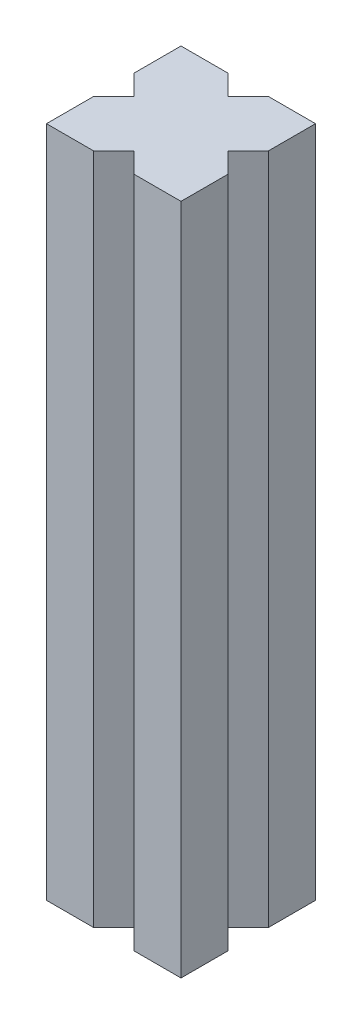
ISO-10303-21;
HEADER;
FILE_DESCRIPTION(('STEP AP214'),'2;1');
FILE_NAME('part.step','',(''),(''),'','','');
FILE_SCHEMA(('AUTOMOTIVE_DESIGN { 1 0 10303 214 1 1 1 1 }'));
ENDSEC;
DATA;
#1=APPLICATION_CONTEXT('core data for automotive mechanical design processes');
#2=APPLICATION_PROTOCOL_DEFINITION('international standard','automotive_design',2000,#1);
#3=PRODUCT_CONTEXT('',#1,'mechanical');
#4=PRODUCT('Part','Part','',(#3));
#5=PRODUCT_RELATED_PRODUCT_CATEGORY('part','',(#4));
#6=PRODUCT_DEFINITION_FORMATION('','',#4);
#7=PRODUCT_DEFINITION_CONTEXT('part definition',#1,'design');
#8=PRODUCT_DEFINITION('design','',#6,#7);
#9=PRODUCT_DEFINITION_SHAPE('','',#8);
#10=(LENGTH_UNIT() NAMED_UNIT(*) SI_UNIT(.MILLI.,.METRE.));
#11=(NAMED_UNIT(*) PLANE_ANGLE_UNIT() SI_UNIT($,.RADIAN.));
#12=(NAMED_UNIT(*) SI_UNIT($,.STERADIAN.) SOLID_ANGLE_UNIT());
#13=UNCERTAINTY_MEASURE_WITH_UNIT(LENGTH_MEASURE(1.E-05),#10,'distance_accuracy_value','');
#14=(GEOMETRIC_REPRESENTATION_CONTEXT(3) GLOBAL_UNCERTAINTY_ASSIGNED_CONTEXT((#13)) GLOBAL_UNIT_ASSIGNED_CONTEXT((#10,
#11,#12)) REPRESENTATION_CONTEXT('',''));
#15=CARTESIAN_POINT('',(0.,0.,0.));
#16=DIRECTION('',(0.,0.,1.));
#17=DIRECTION('',(1.,0.,0.));
#18=AXIS2_PLACEMENT_3D('',#15,#16,#17);
#19=CARTESIAN_POINT('',(0.,100.,0.));
#20=DIRECTION('',(1.,0.,0.));
#21=DIRECTION('',(0.,0.,-1.));
#22=AXIS2_PLACEMENT_3D('',#19,#20,#21);
#23=PLANE('',#22);
#24=DIRECTION('',(0.,0.,1.));
#25=VECTOR('',#24,1.);
#26=CARTESIAN_POINT('',(0.,100.,0.));
#27=LINE('',#26,#25);
#28=CARTESIAN_POINT('',(0.,100.,-7.));
#29=VERTEX_POINT('',#28);
#30=CARTESIAN_POINT('',(0.,100.,0.));
#31=VERTEX_POINT('',#30);
#32=EDGE_CURVE('E186',#29,#31,#27,.T.);
#33=ORIENTED_EDGE('',*,*,#32,.F.);
#34=DIRECTION('',(0.,1.,0.));
#35=VECTOR('',#34,1.);
#36=CARTESIAN_POINT('',(0.,0.,-7.));
#37=LINE('',#36,#35);
#38=CARTESIAN_POINT('',(0.,0.,-7.));
#39=VERTEX_POINT('',#38);
#40=EDGE_CURVE('E235',#39,#29,#37,.T.);
#41=ORIENTED_EDGE('',*,*,#40,.F.);
#42=DIRECTION('',(0.,0.,1.));
#43=VECTOR('',#42,1.);
#44=CARTESIAN_POINT('',(0.,0.,0.));
#45=LINE('',#44,#43);
#46=CARTESIAN_POINT('',(0.,0.,0.));
#47=VERTEX_POINT('',#46);
#48=EDGE_CURVE('E303',#39,#47,#45,.T.);
#49=ORIENTED_EDGE('',*,*,#48,.T.);
#50=DIRECTION('',(0.,-1.,0.));
#51=VECTOR('',#50,1.);
#52=CARTESIAN_POINT('',(0.,100.,0.));
#53=LINE('',#52,#51);
#54=EDGE_CURVE('E11',#31,#47,#53,.T.);
#55=ORIENTED_EDGE('',*,*,#54,.F.);
#56=EDGE_LOOP('',(#33,#41,#49,#55));
#57=FACE_BOUND('',#56,.T.);
#58=ADVANCED_FACE('F38',(#57),#23,.F.);
#59=CARTESIAN_POINT('',(0.,100.,0.));
#60=DIRECTION('',(0.,0.,-1.));
#61=DIRECTION('',(-1.,0.,0.));
#62=AXIS2_PLACEMENT_3D('',#59,#60,#61);
#63=PLANE('',#62);
#64=DIRECTION('',(1.,0.,0.));
#65=VECTOR('',#64,1.);
#66=CARTESIAN_POINT('',(0.,0.,0.));
#67=LINE('',#66,#65);
#68=CARTESIAN_POINT('',(7.,0.,0.));
#69=VERTEX_POINT('',#68);
#70=EDGE_CURVE('E304',#47,#69,#67,.T.);
#71=ORIENTED_EDGE('',*,*,#70,.T.);
#72=DIRECTION('',(0.,1.,0.));
#73=VECTOR('',#72,1.);
#74=CARTESIAN_POINT('',(7.,0.,0.));
#75=LINE('',#74,#73);
#76=CARTESIAN_POINT('',(7.,100.,0.));
#77=VERTEX_POINT('',#76);
#78=EDGE_CURVE('E273',#69,#77,#75,.T.);
#79=ORIENTED_EDGE('',*,*,#78,.T.);
#80=DIRECTION('',(1.,0.,0.));
#81=VECTOR('',#80,1.);
#82=CARTESIAN_POINT('',(0.,100.,0.));
#83=LINE('',#82,#81);
#84=EDGE_CURVE('E293',#31,#77,#83,.T.);
#85=ORIENTED_EDGE('',*,*,#84,.F.);
#86=ORIENTED_EDGE('',*,*,#54,.T.);
#87=EDGE_LOOP('',(#71,#79,#85,#86));
#88=FACE_BOUND('',#87,.T.);
#89=ADVANCED_FACE('F326',(#88),#63,.F.);
#90=CARTESIAN_POINT('',(20.,100.,0.));
#91=DIRECTION('',(-1.,0.,0.));
#92=DIRECTION('',(0.,0.,1.));
#93=AXIS2_PLACEMENT_3D('',#90,#91,#92);
#94=PLANE('',#93);
#95=DIRECTION('',(0.,0.,-1.));
#96=VECTOR('',#95,1.);
#97=CARTESIAN_POINT('',(20.,0.,0.));
#98=LINE('',#97,#96);
#99=CARTESIAN_POINT('',(20.,0.,0.));
#100=VERTEX_POINT('',#99);
#101=CARTESIAN_POINT('',(20.,0.,-7.));
#102=VERTEX_POINT('',#101);
#103=EDGE_CURVE('E179',#100,#102,#98,.T.);
#104=ORIENTED_EDGE('',*,*,#103,.T.);
#105=DIRECTION('',(0.,1.,0.));
#106=VECTOR('',#105,1.);
#107=CARTESIAN_POINT('',(20.,0.,-7.));
#108=LINE('',#107,#106);
#109=CARTESIAN_POINT('',(20.,100.,-7.));
#110=VERTEX_POINT('',#109);
#111=EDGE_CURVE('E238',#102,#110,#108,.T.);
#112=ORIENTED_EDGE('',*,*,#111,.T.);
#113=DIRECTION('',(0.,0.,-1.));
#114=VECTOR('',#113,1.);
#115=CARTESIAN_POINT('',(20.,100.,0.));
#116=LINE('',#115,#114);
#117=CARTESIAN_POINT('',(20.,100.,0.));
#118=VERTEX_POINT('',#117);
#119=EDGE_CURVE('E210',#118,#110,#116,.T.);
#120=ORIENTED_EDGE('',*,*,#119,.F.);
#121=DIRECTION('',(0.,-1.,0.));
#122=VECTOR('',#121,1.);
#123=CARTESIAN_POINT('',(20.,100.,0.));
#124=LINE('',#123,#122);
#125=EDGE_CURVE('E47',#118,#100,#124,.T.);
#126=ORIENTED_EDGE('',*,*,#125,.T.);
#127=EDGE_LOOP('',(#104,#112,#120,#126));
#128=FACE_BOUND('',#127,.T.);
#129=ADVANCED_FACE('F207',(#128),#94,.F.);
#130=CARTESIAN_POINT('',(0.,100.,-20.));
#131=DIRECTION('',(0.,0.,1.));
#132=DIRECTION('',(1.,0.,0.));
#133=AXIS2_PLACEMENT_3D('',#130,#131,#132);
#134=PLANE('',#133);
#135=DIRECTION('',(-1.,0.,0.));
#136=VECTOR('',#135,1.);
#137=CARTESIAN_POINT('',(0.,0.,-20.));
#138=LINE('',#137,#136);
#139=CARTESIAN_POINT('',(20.,0.,-20.));
#140=VERTEX_POINT('',#139);
#141=CARTESIAN_POINT('',(13.,0.,-20.));
#142=VERTEX_POINT('',#141);
#143=EDGE_CURVE('E178',#140,#142,#138,.T.);
#144=ORIENTED_EDGE('',*,*,#143,.T.);
#145=DIRECTION('',(0.,1.,0.));
#146=VECTOR('',#145,1.);
#147=CARTESIAN_POINT('',(13.,0.,-20.));
#148=LINE('',#147,#146);
#149=CARTESIAN_POINT('',(13.,100.,-20.));
#150=VERTEX_POINT('',#149);
#151=EDGE_CURVE('E333',#142,#150,#148,.T.);
#152=ORIENTED_EDGE('',*,*,#151,.T.);
#153=DIRECTION('',(-1.,0.,0.));
#154=VECTOR('',#153,1.);
#155=CARTESIAN_POINT('',(0.,100.,-20.));
#156=LINE('',#155,#154);
#157=CARTESIAN_POINT('',(20.,100.,-20.));
#158=VERTEX_POINT('',#157);
#159=EDGE_CURVE('E196',#158,#150,#156,.T.);
#160=ORIENTED_EDGE('',*,*,#159,.F.);
#161=DIRECTION('',(0.,-1.,0.));
#162=VECTOR('',#161,1.);
#163=CARTESIAN_POINT('',(20.,100.,-20.));
#164=LINE('',#163,#162);
#165=EDGE_CURVE('E195',#158,#140,#164,.T.);
#166=ORIENTED_EDGE('',*,*,#165,.T.);
#167=EDGE_LOOP('',(#144,#152,#160,#166));
#168=FACE_BOUND('',#167,.T.);
#169=ADVANCED_FACE('F352',(#168),#134,.F.);
#170=CARTESIAN_POINT('',(0.,0.,-20.));
#171=VERTEX_POINT('',#170);
#172=CARTESIAN_POINT('',(0.,0.,-13.));
#173=VERTEX_POINT('',#172);
#174=EDGE_CURVE('E176',#171,#173,#45,.T.);
#175=ORIENTED_EDGE('',*,*,#174,.T.);
#176=DIRECTION('',(0.,1.,0.));
#177=VECTOR('',#176,1.);
#178=CARTESIAN_POINT('',(0.,0.,-13.));
#179=LINE('',#178,#177);
#180=CARTESIAN_POINT('',(0.,100.,-13.));
#181=VERTEX_POINT('',#180);
#182=EDGE_CURVE('E259',#173,#181,#179,.T.);
#183=ORIENTED_EDGE('',*,*,#182,.T.);
#184=CARTESIAN_POINT('',(0.,100.,-20.));
#185=VERTEX_POINT('',#184);
#186=EDGE_CURVE('E288',#185,#181,#27,.T.);
#187=ORIENTED_EDGE('',*,*,#186,.F.);
#188=DIRECTION('',(0.,-1.,0.));
#189=VECTOR('',#188,1.);
#190=CARTESIAN_POINT('',(0.,100.,-20.));
#191=LINE('',#190,#189);
#192=EDGE_CURVE('E193',#185,#171,#191,.T.);
#193=ORIENTED_EDGE('',*,*,#192,.T.);
#194=EDGE_LOOP('',(#175,#183,#187,#193));
#195=FACE_BOUND('',#194,.T.);
#196=ADVANCED_FACE('F40',(#195),#23,.F.);
#197=CARTESIAN_POINT('',(13.,100.,0.));
#198=VERTEX_POINT('',#197);
#199=EDGE_CURVE('E292',#198,#118,#83,.T.);
#200=ORIENTED_EDGE('',*,*,#199,.F.);
#201=DIRECTION('',(0.,1.,0.));
#202=VECTOR('',#201,1.);
#203=CARTESIAN_POINT('',(13.,0.,0.));
#204=LINE('',#203,#202);
#205=CARTESIAN_POINT('',(13.,0.,0.));
#206=VERTEX_POINT('',#205);
#207=EDGE_CURVE('E282',#206,#198,#204,.T.);
#208=ORIENTED_EDGE('',*,*,#207,.F.);
#209=EDGE_CURVE('E215',#206,#100,#67,.T.);
#210=ORIENTED_EDGE('',*,*,#209,.T.);
#211=ORIENTED_EDGE('',*,*,#125,.F.);
#212=EDGE_LOOP('',(#200,#208,#210,#211));
#213=FACE_BOUND('',#212,.T.);
#214=ADVANCED_FACE('F315',(#213),#63,.F.);
#215=CARTESIAN_POINT('',(20.,100.,-13.));
#216=VERTEX_POINT('',#215);
#217=EDGE_CURVE('E297',#216,#158,#116,.T.);
#218=ORIENTED_EDGE('',*,*,#217,.F.);
#219=DIRECTION('',(0.,1.,0.));
#220=VECTOR('',#219,1.);
#221=CARTESIAN_POINT('',(20.,0.,-13.));
#222=LINE('',#221,#220);
#223=CARTESIAN_POINT('',(20.,0.,-13.));
#224=VERTEX_POINT('',#223);
#225=EDGE_CURVE('E220',#224,#216,#222,.T.);
#226=ORIENTED_EDGE('',*,*,#225,.F.);
#227=EDGE_CURVE('E189',#224,#140,#98,.T.);
#228=ORIENTED_EDGE('',*,*,#227,.T.);
#229=ORIENTED_EDGE('',*,*,#165,.F.);
#230=EDGE_LOOP('',(#218,#226,#228,#229));
#231=FACE_BOUND('',#230,.T.);
#232=ADVANCED_FACE('F356',(#231),#94,.F.);
#233=CARTESIAN_POINT('',(7.,100.,-20.));
#234=VERTEX_POINT('',#233);
#235=EDGE_CURVE('E169',#234,#185,#156,.T.);
#236=ORIENTED_EDGE('',*,*,#235,.F.);
#237=DIRECTION('',(0.,1.,0.));
#238=VECTOR('',#237,1.);
#239=CARTESIAN_POINT('',(7.,0.,-20.));
#240=LINE('',#239,#238);
#241=CARTESIAN_POINT('',(7.,0.,-20.));
#242=VERTEX_POINT('',#241);
#243=EDGE_CURVE('E155',#242,#234,#240,.T.);
#244=ORIENTED_EDGE('',*,*,#243,.F.);
#245=EDGE_CURVE('E167',#242,#171,#138,.T.);
#246=ORIENTED_EDGE('',*,*,#245,.T.);
#247=ORIENTED_EDGE('',*,*,#192,.F.);
#248=EDGE_LOOP('',(#236,#244,#246,#247));
#249=FACE_BOUND('',#248,.T.);
#250=ADVANCED_FACE('F165',(#249),#134,.F.);
#251=CARTESIAN_POINT('',(0.,100.,0.));
#252=DIRECTION('',(0.,-1.,0.));
#253=DIRECTION('',(0.,0.,-1.));
#254=AXIS2_PLACEMENT_3D('',#251,#252,#253);
#255=PLANE('',#254);
#256=ORIENTED_EDGE('',*,*,#159,.T.);
#257=DIRECTION('',(0.707106781186548,0.,-0.707106781186547));
#258=VECTOR('',#257,1.);
#259=CARTESIAN_POINT('',(13.,100.,-20.));
#260=LINE('',#259,#258);
#261=CARTESIAN_POINT('',(10.,100.,-17.));
#262=VERTEX_POINT('',#261);
#263=EDGE_CURVE('E161',#262,#150,#260,.T.);
#264=ORIENTED_EDGE('',*,*,#263,.F.);
#265=DIRECTION('',(0.707106781186548,0.,0.707106781186547));
#266=VECTOR('',#265,1.);
#267=CARTESIAN_POINT('',(7.,100.,-20.));
#268=LINE('',#267,#266);
#269=EDGE_CURVE('E240',#234,#262,#268,.T.);
#270=ORIENTED_EDGE('',*,*,#269,.F.);
#271=ORIENTED_EDGE('',*,*,#235,.T.);
#272=ORIENTED_EDGE('',*,*,#186,.T.);
#273=DIRECTION('',(-0.707106781186547,0.,-0.707106781186547));
#274=VECTOR('',#273,1.);
#275=CARTESIAN_POINT('',(0.,100.,-13.));
#276=LINE('',#275,#274);
#277=CARTESIAN_POINT('',(3.,100.,-10.));
#278=VERTEX_POINT('',#277);
#279=EDGE_CURVE('E247',#278,#181,#276,.T.);
#280=ORIENTED_EDGE('',*,*,#279,.F.);
#281=DIRECTION('',(0.707106781186547,0.,-0.707106781186548));
#282=VECTOR('',#281,1.);
#283=CARTESIAN_POINT('',(0.,100.,-7.));
#284=LINE('',#283,#282);
#285=EDGE_CURVE('E251',#29,#278,#284,.T.);
#286=ORIENTED_EDGE('',*,*,#285,.F.);
#287=ORIENTED_EDGE('',*,*,#32,.T.);
#288=ORIENTED_EDGE('',*,*,#84,.T.);
#289=DIRECTION('',(-0.707106781186547,0.,0.707106781186548));
#290=VECTOR('',#289,1.);
#291=CARTESIAN_POINT('',(7.,100.,0.));
#292=LINE('',#291,#290);
#293=CARTESIAN_POINT('',(10.,100.,-3.));
#294=VERTEX_POINT('',#293);
#295=EDGE_CURVE('E274',#294,#77,#292,.T.);
#296=ORIENTED_EDGE('',*,*,#295,.F.);
#297=DIRECTION('',(-0.707106781186548,0.,-0.707106781186547));
#298=VECTOR('',#297,1.);
#299=CARTESIAN_POINT('',(13.,100.,0.));
#300=LINE('',#299,#298);
#301=EDGE_CURVE('E270',#198,#294,#300,.T.);
#302=ORIENTED_EDGE('',*,*,#301,.F.);
#303=ORIENTED_EDGE('',*,*,#199,.T.);
#304=ORIENTED_EDGE('',*,*,#119,.T.);
#305=DIRECTION('',(0.707106781186547,0.,0.707106781186548));
#306=VECTOR('',#305,1.);
#307=CARTESIAN_POINT('',(20.,100.,-7.));
#308=LINE('',#307,#306);
#309=CARTESIAN_POINT('',(17.,100.,-10.));
#310=VERTEX_POINT('',#309);
#311=EDGE_CURVE('E228',#310,#110,#308,.T.);
#312=ORIENTED_EDGE('',*,*,#311,.F.);
#313=DIRECTION('',(-0.707106781186547,0.,0.707106781186548));
#314=VECTOR('',#313,1.);
#315=CARTESIAN_POINT('',(20.,100.,-13.));
#316=LINE('',#315,#314);
#317=EDGE_CURVE('E231',#216,#310,#316,.T.);
#318=ORIENTED_EDGE('',*,*,#317,.F.);
#319=ORIENTED_EDGE('',*,*,#217,.T.);
#320=EDGE_LOOP('',(#256,#264,#270,#271,#272,#280,#286,#287,#288,#296,#302,#303,#304,#312,#318,#319));
#321=FACE_BOUND('',#320,.T.);
#322=ADVANCED_FACE('F322',(#321),#255,.F.);
#323=CARTESIAN_POINT('',(0.,0.,0.));
#324=DIRECTION('',(0.,-1.,0.));
#325=DIRECTION('',(0.,0.,-1.));
#326=AXIS2_PLACEMENT_3D('',#323,#324,#325);
#327=PLANE('',#326);
#328=DIRECTION('',(0.707106781186548,0.,-0.707106781186547));
#329=VECTOR('',#328,1.);
#330=CARTESIAN_POINT('',(13.,0.,-20.));
#331=LINE('',#330,#329);
#332=CARTESIAN_POINT('',(10.,0.,-17.));
#333=VERTEX_POINT('',#332);
#334=EDGE_CURVE('E54',#333,#142,#331,.T.);
#335=ORIENTED_EDGE('',*,*,#334,.T.);
#336=ORIENTED_EDGE('',*,*,#143,.F.);
#337=ORIENTED_EDGE('',*,*,#227,.F.);
#338=DIRECTION('',(-0.707106781186547,0.,0.707106781186548));
#339=VECTOR('',#338,1.);
#340=CARTESIAN_POINT('',(20.,0.,-13.));
#341=LINE('',#340,#339);
#342=CARTESIAN_POINT('',(17.,0.,-10.));
#343=VERTEX_POINT('',#342);
#344=EDGE_CURVE('E218',#224,#343,#341,.T.);
#345=ORIENTED_EDGE('',*,*,#344,.T.);
#346=DIRECTION('',(0.707106781186547,0.,0.707106781186548));
#347=VECTOR('',#346,1.);
#348=CARTESIAN_POINT('',(20.,0.,-7.));
#349=LINE('',#348,#347);
#350=EDGE_CURVE('E62',#343,#102,#349,.T.);
#351=ORIENTED_EDGE('',*,*,#350,.T.);
#352=ORIENTED_EDGE('',*,*,#103,.F.);
#353=ORIENTED_EDGE('',*,*,#209,.F.);
#354=DIRECTION('',(-0.707106781186548,0.,-0.707106781186547));
#355=VECTOR('',#354,1.);
#356=CARTESIAN_POINT('',(13.,0.,0.));
#357=LINE('',#356,#355);
#358=CARTESIAN_POINT('',(10.,0.,-3.));
#359=VERTEX_POINT('',#358);
#360=EDGE_CURVE('E269',#206,#359,#357,.T.);
#361=ORIENTED_EDGE('',*,*,#360,.T.);
#362=DIRECTION('',(-0.707106781186547,0.,0.707106781186548));
#363=VECTOR('',#362,1.);
#364=CARTESIAN_POINT('',(7.,0.,0.));
#365=LINE('',#364,#363);
#366=EDGE_CURVE('E265',#359,#69,#365,.T.);
#367=ORIENTED_EDGE('',*,*,#366,.T.);
#368=ORIENTED_EDGE('',*,*,#70,.F.);
#369=ORIENTED_EDGE('',*,*,#48,.F.);
#370=DIRECTION('',(0.707106781186547,0.,-0.707106781186548));
#371=VECTOR('',#370,1.);
#372=CARTESIAN_POINT('',(0.,0.,-7.));
#373=LINE('',#372,#371);
#374=CARTESIAN_POINT('',(3.,0.,-10.));
#375=VERTEX_POINT('',#374);
#376=EDGE_CURVE('E242',#39,#375,#373,.T.);
#377=ORIENTED_EDGE('',*,*,#376,.T.);
#378=DIRECTION('',(-0.707106781186547,0.,-0.707106781186547));
#379=VECTOR('',#378,1.);
#380=CARTESIAN_POINT('',(0.,0.,-13.));
#381=LINE('',#380,#379);
#382=EDGE_CURVE('E246',#375,#173,#381,.T.);
#383=ORIENTED_EDGE('',*,*,#382,.T.);
#384=ORIENTED_EDGE('',*,*,#174,.F.);
#385=ORIENTED_EDGE('',*,*,#245,.F.);
#386=DIRECTION('',(0.707106781186548,0.,0.707106781186547));
#387=VECTOR('',#386,1.);
#388=CARTESIAN_POINT('',(7.,0.,-20.));
#389=LINE('',#388,#387);
#390=EDGE_CURVE('E151',#242,#333,#389,.T.);
#391=ORIENTED_EDGE('',*,*,#390,.T.);
#392=EDGE_LOOP('',(#335,#336,#337,#345,#351,#352,#353,#361,#367,#368,#369,#377,#383,#384,#385,#391));
#393=FACE_BOUND('',#392,.T.);
#394=ADVANCED_FACE('F173',(#393),#327,.T.);
#395=CARTESIAN_POINT('',(7.,0.,0.));
#396=DIRECTION('',(-0.707106781186548,0.,-0.707106781186547));
#397=DIRECTION('',(-0.707106781186547,0.,0.707106781186548));
#398=AXIS2_PLACEMENT_3D('',#395,#396,#397);
#399=PLANE('',#398);
#400=ORIENTED_EDGE('',*,*,#295,.T.);
#401=ORIENTED_EDGE('',*,*,#78,.F.);
#402=ORIENTED_EDGE('',*,*,#366,.F.);
#403=DIRECTION('',(0.,1.,0.));
#404=VECTOR('',#403,1.);
#405=CARTESIAN_POINT('',(10.,0.,-3.));
#406=LINE('',#405,#404);
#407=EDGE_CURVE('E255',#359,#294,#406,.T.);
#408=ORIENTED_EDGE('',*,*,#407,.T.);
#409=EDGE_LOOP('',(#400,#401,#402,#408));
#410=FACE_BOUND('',#409,.T.);
#411=ADVANCED_FACE('F325',(#410),#399,.F.);
#412=CARTESIAN_POINT('',(13.,0.,0.));
#413=DIRECTION('',(0.707106781186547,0.,-0.707106781186548));
#414=DIRECTION('',(-0.707106781186548,0.,-0.707106781186547));
#415=AXIS2_PLACEMENT_3D('',#412,#413,#414);
#416=PLANE('',#415);
#417=ORIENTED_EDGE('',*,*,#301,.T.);
#418=ORIENTED_EDGE('',*,*,#407,.F.);
#419=ORIENTED_EDGE('',*,*,#360,.F.);
#420=ORIENTED_EDGE('',*,*,#207,.T.);
#421=EDGE_LOOP('',(#417,#418,#419,#420));
#422=FACE_BOUND('',#421,.T.);
#423=ADVANCED_FACE('F318',(#422),#416,.F.);
#424=CARTESIAN_POINT('',(0.,0.,-7.));
#425=DIRECTION('',(0.707106781186548,0.,0.707106781186547));
#426=DIRECTION('',(0.707106781186547,0.,-0.707106781186548));
#427=AXIS2_PLACEMENT_3D('',#424,#425,#426);
#428=PLANE('',#427);
#429=ORIENTED_EDGE('',*,*,#285,.T.);
#430=DIRECTION('',(0.,1.,0.));
#431=VECTOR('',#430,1.);
#432=CARTESIAN_POINT('',(3.,0.,-10.));
#433=LINE('',#432,#431);
#434=EDGE_CURVE('E250',#375,#278,#433,.T.);
#435=ORIENTED_EDGE('',*,*,#434,.F.);
#436=ORIENTED_EDGE('',*,*,#376,.F.);
#437=ORIENTED_EDGE('',*,*,#40,.T.);
#438=EDGE_LOOP('',(#429,#435,#436,#437));
#439=FACE_BOUND('',#438,.T.);
#440=ADVANCED_FACE('F372',(#439),#428,.F.);
#441=CARTESIAN_POINT('',(0.,0.,-13.));
#442=DIRECTION('',(0.707106781186547,0.,-0.707106781186547));
#443=DIRECTION('',(-0.707106781186548,0.,-0.707106781186548));
#444=AXIS2_PLACEMENT_3D('',#441,#442,#443);
#445=PLANE('',#444);
#446=ORIENTED_EDGE('',*,*,#279,.T.);
#447=ORIENTED_EDGE('',*,*,#182,.F.);
#448=ORIENTED_EDGE('',*,*,#382,.F.);
#449=ORIENTED_EDGE('',*,*,#434,.T.);
#450=EDGE_LOOP('',(#446,#447,#448,#449));
#451=FACE_BOUND('',#450,.T.);
#452=ADVANCED_FACE('F364',(#451),#445,.F.);
#453=CARTESIAN_POINT('',(20.,0.,-7.));
#454=DIRECTION('',(-0.707106781186548,0.,0.707106781186547));
#455=DIRECTION('',(0.707106781186547,0.,0.707106781186548));
#456=AXIS2_PLACEMENT_3D('',#453,#454,#455);
#457=PLANE('',#456);
#458=ORIENTED_EDGE('',*,*,#311,.T.);
#459=ORIENTED_EDGE('',*,*,#111,.F.);
#460=ORIENTED_EDGE('',*,*,#350,.F.);
#461=DIRECTION('',(0.,1.,0.));
#462=VECTOR('',#461,1.);
#463=CARTESIAN_POINT('',(17.,0.,-10.));
#464=LINE('',#463,#462);
#465=EDGE_CURVE('E226',#343,#310,#464,.T.);
#466=ORIENTED_EDGE('',*,*,#465,.T.);
#467=EDGE_LOOP('',(#458,#459,#460,#466));
#468=FACE_BOUND('',#467,.T.);
#469=ADVANCED_FACE('F362',(#468),#457,.F.);
#470=CARTESIAN_POINT('',(20.,0.,-13.));
#471=DIRECTION('',(-0.707106781186548,0.,-0.707106781186547));
#472=DIRECTION('',(-0.707106781186547,0.,0.707106781186548));
#473=AXIS2_PLACEMENT_3D('',#470,#471,#472);
#474=PLANE('',#473);
#475=ORIENTED_EDGE('',*,*,#317,.T.);
#476=ORIENTED_EDGE('',*,*,#465,.F.);
#477=ORIENTED_EDGE('',*,*,#344,.F.);
#478=ORIENTED_EDGE('',*,*,#225,.T.);
#479=EDGE_LOOP('',(#475,#476,#477,#478));
#480=FACE_BOUND('',#479,.T.);
#481=ADVANCED_FACE('F360',(#480),#474,.F.);
#482=CARTESIAN_POINT('',(13.,0.,-20.));
#483=DIRECTION('',(0.707106781186547,0.,0.707106781186548));
#484=DIRECTION('',(0.707106781186548,0.,-0.707106781186547));
#485=AXIS2_PLACEMENT_3D('',#482,#483,#484);
#486=PLANE('',#485);
#487=ORIENTED_EDGE('',*,*,#263,.T.);
#488=ORIENTED_EDGE('',*,*,#151,.F.);
#489=ORIENTED_EDGE('',*,*,#334,.F.);
#490=DIRECTION('',(0.,1.,0.));
#491=VECTOR('',#490,1.);
#492=CARTESIAN_POINT('',(10.,0.,-17.));
#493=LINE('',#492,#491);
#494=EDGE_CURVE('E157',#333,#262,#493,.T.);
#495=ORIENTED_EDGE('',*,*,#494,.T.);
#496=EDGE_LOOP('',(#487,#488,#489,#495));
#497=FACE_BOUND('',#496,.T.);
#498=ADVANCED_FACE('F370',(#497),#486,.F.);
#499=CARTESIAN_POINT('',(7.,0.,-20.));
#500=DIRECTION('',(-0.707106781186547,0.,0.707106781186548));
#501=DIRECTION('',(0.707106781186548,0.,0.707106781186547));
#502=AXIS2_PLACEMENT_3D('',#499,#500,#501);
#503=PLANE('',#502);
#504=ORIENTED_EDGE('',*,*,#269,.T.);
#505=ORIENTED_EDGE('',*,*,#494,.F.);
#506=ORIENTED_EDGE('',*,*,#390,.F.);
#507=ORIENTED_EDGE('',*,*,#243,.T.);
#508=EDGE_LOOP('',(#504,#505,#506,#507));
#509=FACE_BOUND('',#508,.T.);
#510=ADVANCED_FACE('F154',(#509),#503,.F.);
#511=CLOSED_SHELL('',(#58,#89,#129,#169,#196,#214,#232,#250,#322,#394,#411,#423,#440,#452,#469,
#481,#498,#510));
#512=MANIFOLD_SOLID_BREP('B2',#511);
#513=ADVANCED_BREP_SHAPE_REPRESENTATION('',(#18,#512),#14);
#514=SHAPE_DEFINITION_REPRESENTATION(#9,#513);
ENDSEC;
END-ISO-10303-21;
